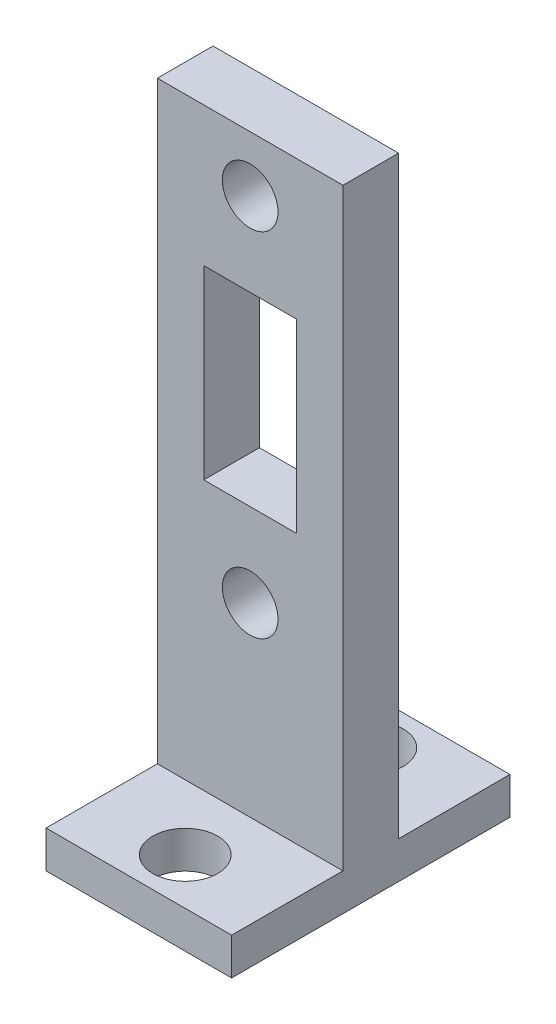
ISO-10303-21;
HEADER;
FILE_DESCRIPTION(('STEP AP214'),'2;1');
FILE_NAME('part.step','',(''),(''),'','','');
FILE_SCHEMA(('AUTOMOTIVE_DESIGN { 1 0 10303 214 1 1 1 1 }'));
ENDSEC;
DATA;
#1=APPLICATION_CONTEXT('core data for automotive mechanical design processes');
#2=APPLICATION_PROTOCOL_DEFINITION('international standard','automotive_design',2000,#1);
#3=PRODUCT_CONTEXT('',#1,'mechanical');
#4=PRODUCT('Part','Part','',(#3));
#5=PRODUCT_RELATED_PRODUCT_CATEGORY('part','',(#4));
#6=PRODUCT_DEFINITION_FORMATION('','',#4);
#7=PRODUCT_DEFINITION_CONTEXT('part definition',#1,'design');
#8=PRODUCT_DEFINITION('design','',#6,#7);
#9=PRODUCT_DEFINITION_SHAPE('','',#8);
#10=(LENGTH_UNIT() NAMED_UNIT(*) SI_UNIT(.MILLI.,.METRE.));
#11=(NAMED_UNIT(*) PLANE_ANGLE_UNIT() SI_UNIT($,.RADIAN.));
#12=(NAMED_UNIT(*) SI_UNIT($,.STERADIAN.) SOLID_ANGLE_UNIT());
#13=UNCERTAINTY_MEASURE_WITH_UNIT(LENGTH_MEASURE(1.E-05),#10,'distance_accuracy_value','');
#14=(GEOMETRIC_REPRESENTATION_CONTEXT(3) GLOBAL_UNCERTAINTY_ASSIGNED_CONTEXT((#13)) GLOBAL_UNIT_ASSIGNED_CONTEXT((#10,
#11,#12)) REPRESENTATION_CONTEXT('',''));
#15=CARTESIAN_POINT('',(0.,0.,0.));
#16=DIRECTION('',(0.,0.,1.));
#17=DIRECTION('',(1.,0.,0.));
#18=AXIS2_PLACEMENT_3D('',#15,#16,#17);
#19=CARTESIAN_POINT('',(0.,2.,0.));
#20=DIRECTION('',(0.,1.,0.));
#21=DIRECTION('',(0.,0.,1.));
#22=AXIS2_PLACEMENT_3D('',#19,#20,#21);
#23=PLANE('',#22);
#24=DIRECTION('',(1.,0.,0.));
#25=VECTOR('',#24,1.);
#26=CARTESIAN_POINT('',(-5.,2.,1.5));
#27=LINE('',#26,#25);
#28=CARTESIAN_POINT('',(-5.,2.,1.5));
#29=VERTEX_POINT('',#28);
#30=CARTESIAN_POINT('',(5.,2.,1.5));
#31=VERTEX_POINT('',#30);
#32=EDGE_CURVE('E199',#29,#31,#27,.T.);
#33=ORIENTED_EDGE('',*,*,#32,.F.);
#34=DIRECTION('',(0.,0.,1.));
#35=VECTOR('',#34,1.);
#36=CARTESIAN_POINT('',(-5.,2.,7.5));
#37=LINE('',#36,#35);
#38=CARTESIAN_POINT('',(-5.,2.,7.5));
#39=VERTEX_POINT('',#38);
#40=EDGE_CURVE('E251',#29,#39,#37,.T.);
#41=ORIENTED_EDGE('',*,*,#40,.T.);
#42=DIRECTION('',(1.,0.,0.));
#43=VECTOR('',#42,1.);
#44=CARTESIAN_POINT('',(5.,2.,7.5));
#45=LINE('',#44,#43);
#46=CARTESIAN_POINT('',(5.,2.,7.5));
#47=VERTEX_POINT('',#46);
#48=EDGE_CURVE('E250',#39,#47,#45,.T.);
#49=ORIENTED_EDGE('',*,*,#48,.T.);
#50=DIRECTION('',(0.,0.,-1.));
#51=VECTOR('',#50,1.);
#52=CARTESIAN_POINT('',(5.,2.,7.5));
#53=LINE('',#52,#51);
#54=EDGE_CURVE('E255',#47,#31,#53,.T.);
#55=ORIENTED_EDGE('',*,*,#54,.T.);
#56=EDGE_LOOP('',(#33,#41,#49,#55));
#57=FACE_BOUND('',#56,.T.);
#58=CARTESIAN_POINT('',(0.,2.,5.));
#59=DIRECTION('',(0.,1.,0.));
#60=DIRECTION('',(0.,0.,1.));
#61=AXIS2_PLACEMENT_3D('',#58,#59,#60);
#62=CIRCLE('',#61,1.75);
#63=CARTESIAN_POINT('',(0.,2.,6.75));
#64=VERTEX_POINT('',#63);
#65=EDGE_CURVE('E231',#64,#64,#62,.T.);
#66=ORIENTED_EDGE('',*,*,#65,.F.);
#67=EDGE_LOOP('',(#66));
#68=FACE_BOUND('',#67,.T.);
#69=ADVANCED_FACE('F39',(#57,#68),#23,.T.);
#70=DIRECTION('',(-1.,0.,0.));
#71=VECTOR('',#70,1.);
#72=CARTESIAN_POINT('',(-5.,2.,-1.5));
#73=LINE('',#72,#71);
#74=CARTESIAN_POINT('',(5.,2.,-1.5));
#75=VERTEX_POINT('',#74);
#76=CARTESIAN_POINT('',(-5.,2.,-1.5));
#77=VERTEX_POINT('',#76);
#78=EDGE_CURVE('E193',#75,#77,#73,.T.);
#79=ORIENTED_EDGE('',*,*,#78,.F.);
#80=CARTESIAN_POINT('',(5.,2.,-7.5));
#81=VERTEX_POINT('',#80);
#82=EDGE_CURVE('E254',#75,#81,#53,.T.);
#83=ORIENTED_EDGE('',*,*,#82,.T.);
#84=DIRECTION('',(-1.,0.,0.));
#85=VECTOR('',#84,1.);
#86=CARTESIAN_POINT('',(5.,2.,-7.5));
#87=LINE('',#86,#85);
#88=CARTESIAN_POINT('',(-5.,2.,-7.5));
#89=VERTEX_POINT('',#88);
#90=EDGE_CURVE('E258',#81,#89,#87,.T.);
#91=ORIENTED_EDGE('',*,*,#90,.T.);
#92=EDGE_CURVE('E247',#89,#77,#37,.T.);
#93=ORIENTED_EDGE('',*,*,#92,.T.);
#94=EDGE_LOOP('',(#79,#83,#91,#93));
#95=FACE_BOUND('',#94,.T.);
#96=CARTESIAN_POINT('',(0.,2.,-5.));
#97=DIRECTION('',(0.,1.,0.));
#98=DIRECTION('',(0.,0.,1.));
#99=AXIS2_PLACEMENT_3D('',#96,#97,#98);
#100=CIRCLE('',#99,1.75);
#101=CARTESIAN_POINT('',(0.,2.,-3.25));
#102=VERTEX_POINT('',#101);
#103=EDGE_CURVE('E239',#102,#102,#100,.T.);
#104=ORIENTED_EDGE('',*,*,#103,.F.);
#105=EDGE_LOOP('',(#104));
#106=FACE_BOUND('',#105,.T.);
#107=ADVANCED_FACE('F305',(#95,#106),#23,.T.);
#108=CARTESIAN_POINT('',(0.,0.,0.));
#109=DIRECTION('',(0.,1.,0.));
#110=DIRECTION('',(0.,0.,1.));
#111=AXIS2_PLACEMENT_3D('',#108,#109,#110);
#112=PLANE('',#111);
#113=DIRECTION('',(0.,0.,1.));
#114=VECTOR('',#113,1.);
#115=CARTESIAN_POINT('',(-5.,0.,7.5));
#116=LINE('',#115,#114);
#117=CARTESIAN_POINT('',(-5.,0.,-7.5));
#118=VERTEX_POINT('',#117);
#119=CARTESIAN_POINT('',(-5.,0.,7.5));
#120=VERTEX_POINT('',#119);
#121=EDGE_CURVE('E243',#118,#120,#116,.T.);
#122=ORIENTED_EDGE('',*,*,#121,.F.);
#123=DIRECTION('',(-1.,0.,0.));
#124=VECTOR('',#123,1.);
#125=CARTESIAN_POINT('',(5.,0.,-7.5));
#126=LINE('',#125,#124);
#127=CARTESIAN_POINT('',(5.,0.,-7.5));
#128=VERTEX_POINT('',#127);
#129=EDGE_CURVE('E271',#128,#118,#126,.T.);
#130=ORIENTED_EDGE('',*,*,#129,.F.);
#131=DIRECTION('',(0.,0.,-1.));
#132=VECTOR('',#131,1.);
#133=CARTESIAN_POINT('',(5.,0.,7.5));
#134=LINE('',#133,#132);
#135=CARTESIAN_POINT('',(5.,0.,7.5));
#136=VERTEX_POINT('',#135);
#137=EDGE_CURVE('E268',#136,#128,#134,.T.);
#138=ORIENTED_EDGE('',*,*,#137,.F.);
#139=DIRECTION('',(1.,0.,0.));
#140=VECTOR('',#139,1.);
#141=CARTESIAN_POINT('',(5.,0.,7.5));
#142=LINE('',#141,#140);
#143=EDGE_CURVE('E265',#120,#136,#142,.T.);
#144=ORIENTED_EDGE('',*,*,#143,.F.);
#145=EDGE_LOOP('',(#122,#130,#138,#144));
#146=FACE_BOUND('',#145,.T.);
#147=CARTESIAN_POINT('',(0.,0.,-5.));
#148=DIRECTION('',(0.,1.,0.));
#149=DIRECTION('',(0.,0.,1.));
#150=AXIS2_PLACEMENT_3D('',#147,#148,#149);
#151=CIRCLE('',#150,1.75);
#152=CARTESIAN_POINT('',(0.,0.,-3.25));
#153=VERTEX_POINT('',#152);
#154=EDGE_CURVE('E235',#153,#153,#151,.T.);
#155=ORIENTED_EDGE('',*,*,#154,.T.);
#156=EDGE_LOOP('',(#155));
#157=FACE_BOUND('',#156,.T.);
#158=CARTESIAN_POINT('',(0.,0.,5.));
#159=DIRECTION('',(0.,1.,0.));
#160=DIRECTION('',(0.,0.,1.));
#161=AXIS2_PLACEMENT_3D('',#158,#159,#160);
#162=CIRCLE('',#161,1.75);
#163=CARTESIAN_POINT('',(0.,0.,6.75));
#164=VERTEX_POINT('',#163);
#165=EDGE_CURVE('E230',#164,#164,#162,.T.);
#166=ORIENTED_EDGE('',*,*,#165,.T.);
#167=EDGE_LOOP('',(#166));
#168=FACE_BOUND('',#167,.T.);
#169=ADVANCED_FACE('F293',(#146,#157,#168),#112,.F.);
#170=CARTESIAN_POINT('',(-5.,2.,7.5));
#171=DIRECTION('',(1.,0.,0.));
#172=DIRECTION('',(0.,0.,-1.));
#173=AXIS2_PLACEMENT_3D('',#170,#171,#172);
#174=PLANE('',#173);
#175=ORIENTED_EDGE('',*,*,#121,.T.);
#176=DIRECTION('',(0.,-1.,0.));
#177=VECTOR('',#176,1.);
#178=CARTESIAN_POINT('',(-5.,2.,7.5));
#179=LINE('',#178,#177);
#180=EDGE_CURVE('E11',#39,#120,#179,.T.);
#181=ORIENTED_EDGE('',*,*,#180,.F.);
#182=ORIENTED_EDGE('',*,*,#40,.F.);
#183=DIRECTION('',(0.,-1.,0.));
#184=VECTOR('',#183,1.);
#185=CARTESIAN_POINT('',(-5.,34.,1.5));
#186=LINE('',#185,#184);
#187=CARTESIAN_POINT('',(-5.,34.,1.5));
#188=VERTEX_POINT('',#187);
#189=EDGE_CURVE('E218',#188,#29,#186,.T.);
#190=ORIENTED_EDGE('',*,*,#189,.F.);
#191=DIRECTION('',(0.,0.,1.));
#192=VECTOR('',#191,1.);
#193=CARTESIAN_POINT('',(-5.,34.,-1.5));
#194=LINE('',#193,#192);
#195=CARTESIAN_POINT('',(-5.,34.,-1.5));
#196=VERTEX_POINT('',#195);
#197=EDGE_CURVE('E202',#196,#188,#194,.T.);
#198=ORIENTED_EDGE('',*,*,#197,.F.);
#199=DIRECTION('',(0.,-1.,0.));
#200=VECTOR('',#199,1.);
#201=CARTESIAN_POINT('',(-5.,34.,-1.5));
#202=LINE('',#201,#200);
#203=EDGE_CURVE('E222',#196,#77,#202,.T.);
#204=ORIENTED_EDGE('',*,*,#203,.T.);
#205=ORIENTED_EDGE('',*,*,#92,.F.);
#206=DIRECTION('',(0.,-1.,0.));
#207=VECTOR('',#206,1.);
#208=CARTESIAN_POINT('',(-5.,2.,-7.5));
#209=LINE('',#208,#207);
#210=EDGE_CURVE('E261',#89,#118,#209,.T.);
#211=ORIENTED_EDGE('',*,*,#210,.T.);
#212=EDGE_LOOP('',(#175,#181,#182,#190,#198,#204,#205,#211));
#213=FACE_BOUND('',#212,.T.);
#214=ADVANCED_FACE('F41',(#213),#174,.F.);
#215=CARTESIAN_POINT('',(5.,2.,7.5));
#216=DIRECTION('',(0.,0.,-1.));
#217=DIRECTION('',(-1.,0.,0.));
#218=AXIS2_PLACEMENT_3D('',#215,#216,#217);
#219=PLANE('',#218);
#220=ORIENTED_EDGE('',*,*,#143,.T.);
#221=DIRECTION('',(0.,-1.,0.));
#222=VECTOR('',#221,1.);
#223=CARTESIAN_POINT('',(5.,2.,7.5));
#224=LINE('',#223,#222);
#225=EDGE_CURVE('E48',#47,#136,#224,.T.);
#226=ORIENTED_EDGE('',*,*,#225,.F.);
#227=ORIENTED_EDGE('',*,*,#48,.F.);
#228=ORIENTED_EDGE('',*,*,#180,.T.);
#229=EDGE_LOOP('',(#220,#226,#227,#228));
#230=FACE_BOUND('',#229,.T.);
#231=ADVANCED_FACE('F318',(#230),#219,.F.);
#232=CARTESIAN_POINT('',(5.,2.,7.5));
#233=DIRECTION('',(-1.,0.,0.));
#234=DIRECTION('',(0.,0.,1.));
#235=AXIS2_PLACEMENT_3D('',#232,#233,#234);
#236=PLANE('',#235);
#237=ORIENTED_EDGE('',*,*,#137,.T.);
#238=DIRECTION('',(0.,-1.,0.));
#239=VECTOR('',#238,1.);
#240=CARTESIAN_POINT('',(5.,2.,-7.5));
#241=LINE('',#240,#239);
#242=EDGE_CURVE('E277',#81,#128,#241,.T.);
#243=ORIENTED_EDGE('',*,*,#242,.F.);
#244=ORIENTED_EDGE('',*,*,#82,.F.);
#245=DIRECTION('',(0.,-1.,0.));
#246=VECTOR('',#245,1.);
#247=CARTESIAN_POINT('',(5.,34.,-1.5));
#248=LINE('',#247,#246);
#249=CARTESIAN_POINT('',(5.,34.,-1.5));
#250=VERTEX_POINT('',#249);
#251=EDGE_CURVE('E226',#250,#75,#248,.T.);
#252=ORIENTED_EDGE('',*,*,#251,.F.);
#253=DIRECTION('',(0.,0.,-1.));
#254=VECTOR('',#253,1.);
#255=CARTESIAN_POINT('',(5.,34.,-1.5));
#256=LINE('',#255,#254);
#257=CARTESIAN_POINT('',(5.,34.,1.5));
#258=VERTEX_POINT('',#257);
#259=EDGE_CURVE('E194',#258,#250,#256,.T.);
#260=ORIENTED_EDGE('',*,*,#259,.F.);
#261=DIRECTION('',(0.,-1.,0.));
#262=VECTOR('',#261,1.);
#263=CARTESIAN_POINT('',(5.,34.,1.5));
#264=LINE('',#263,#262);
#265=EDGE_CURVE('E208',#258,#31,#264,.T.);
#266=ORIENTED_EDGE('',*,*,#265,.T.);
#267=ORIENTED_EDGE('',*,*,#54,.F.);
#268=ORIENTED_EDGE('',*,*,#225,.T.);
#269=EDGE_LOOP('',(#237,#243,#244,#252,#260,#266,#267,#268));
#270=FACE_BOUND('',#269,.T.);
#271=ADVANCED_FACE('F286',(#270),#236,.F.);
#272=CARTESIAN_POINT('',(5.,2.,-7.5));
#273=DIRECTION('',(0.,0.,1.));
#274=DIRECTION('',(1.,0.,0.));
#275=AXIS2_PLACEMENT_3D('',#272,#273,#274);
#276=PLANE('',#275);
#277=ORIENTED_EDGE('',*,*,#129,.T.);
#278=ORIENTED_EDGE('',*,*,#210,.F.);
#279=ORIENTED_EDGE('',*,*,#90,.F.);
#280=ORIENTED_EDGE('',*,*,#242,.T.);
#281=EDGE_LOOP('',(#277,#278,#279,#280));
#282=FACE_BOUND('',#281,.T.);
#283=ADVANCED_FACE('F297',(#282),#276,.F.);
#284=CARTESIAN_POINT('',(0.,2.,-5.));
#285=DIRECTION('',(0.,-1.,0.));
#286=DIRECTION('',(0.,0.,-1.));
#287=AXIS2_PLACEMENT_3D('',#284,#285,#286);
#288=CYLINDRICAL_SURFACE('',#287,1.75);
#289=ORIENTED_EDGE('',*,*,#103,.T.);
#290=EDGE_LOOP('',(#289));
#291=FACE_BOUND('',#290,.T.);
#292=ORIENTED_EDGE('',*,*,#154,.F.);
#293=EDGE_LOOP('',(#292));
#294=FACE_BOUND('',#293,.T.);
#295=ADVANCED_FACE('F332',(#291,#294),#288,.F.);
#296=CARTESIAN_POINT('',(0.,2.,5.));
#297=DIRECTION('',(0.,-1.,0.));
#298=DIRECTION('',(0.,0.,-1.));
#299=AXIS2_PLACEMENT_3D('',#296,#297,#298);
#300=CYLINDRICAL_SURFACE('',#299,1.75);
#301=ORIENTED_EDGE('',*,*,#65,.T.);
#302=EDGE_LOOP('',(#301));
#303=FACE_BOUND('',#302,.T.);
#304=ORIENTED_EDGE('',*,*,#165,.F.);
#305=EDGE_LOOP('',(#304));
#306=FACE_BOUND('',#305,.T.);
#307=ADVANCED_FACE('F340',(#303,#306),#300,.F.);
#308=CARTESIAN_POINT('',(-5.,34.,-1.5));
#309=DIRECTION('',(0.,0.,1.));
#310=DIRECTION('',(1.,0.,0.));
#311=AXIS2_PLACEMENT_3D('',#308,#309,#310);
#312=PLANE('',#311);
#313=DIRECTION('',(1.,0.,0.));
#314=VECTOR('',#313,1.);
#315=CARTESIAN_POINT('',(-5.,16.5,-1.5));
#316=LINE('',#315,#314);
#317=CARTESIAN_POINT('',(-2.5,16.5,-1.5));
#318=VERTEX_POINT('',#317);
#319=CARTESIAN_POINT('',(2.5,16.5,-1.5));
#320=VERTEX_POINT('',#319);
#321=EDGE_CURVE('E169',#318,#320,#316,.T.);
#322=ORIENTED_EDGE('',*,*,#321,.T.);
#323=DIRECTION('',(0.,1.,0.));
#324=VECTOR('',#323,1.);
#325=CARTESIAN_POINT('',(2.5,34.,-1.5));
#326=LINE('',#325,#324);
#327=CARTESIAN_POINT('',(2.5,26.5,-1.5));
#328=VERTEX_POINT('',#327);
#329=EDGE_CURVE('E173',#320,#328,#326,.T.);
#330=ORIENTED_EDGE('',*,*,#329,.T.);
#331=DIRECTION('',(-1.,0.,0.));
#332=VECTOR('',#331,1.);
#333=CARTESIAN_POINT('',(-5.,26.5,-1.5));
#334=LINE('',#333,#332);
#335=CARTESIAN_POINT('',(-2.5,26.5,-1.5));
#336=VERTEX_POINT('',#335);
#337=EDGE_CURVE('E160',#328,#336,#334,.T.);
#338=ORIENTED_EDGE('',*,*,#337,.T.);
#339=DIRECTION('',(0.,-1.,0.));
#340=VECTOR('',#339,1.);
#341=CARTESIAN_POINT('',(-2.5,34.,-1.5));
#342=LINE('',#341,#340);
#343=EDGE_CURVE('E135',#336,#318,#342,.T.);
#344=ORIENTED_EDGE('',*,*,#343,.T.);
#345=EDGE_LOOP('',(#322,#330,#338,#344));
#346=FACE_BOUND('',#345,.T.);
#347=CARTESIAN_POINT('',(0.,31.,-1.5));
#348=DIRECTION('',(0.,0.,1.));
#349=DIRECTION('',(1.,0.,0.));
#350=AXIS2_PLACEMENT_3D('',#347,#348,#349);
#351=CIRCLE('',#350,1.5);
#352=CARTESIAN_POINT('',(1.5,31.,-1.5));
#353=VERTEX_POINT('',#352);
#354=EDGE_CURVE('E189',#353,#353,#351,.T.);
#355=ORIENTED_EDGE('',*,*,#354,.T.);
#356=EDGE_LOOP('',(#355));
#357=FACE_BOUND('',#356,.T.);
#358=CARTESIAN_POINT('',(0.,12.,-1.5));
#359=DIRECTION('',(0.,0.,1.));
#360=DIRECTION('',(1.,0.,0.));
#361=AXIS2_PLACEMENT_3D('',#358,#359,#360);
#362=CIRCLE('',#361,1.5);
#363=CARTESIAN_POINT('',(1.5,12.,-1.5));
#364=VERTEX_POINT('',#363);
#365=EDGE_CURVE('E182',#364,#364,#362,.T.);
#366=ORIENTED_EDGE('',*,*,#365,.T.);
#367=EDGE_LOOP('',(#366));
#368=FACE_BOUND('',#367,.T.);
#369=ORIENTED_EDGE('',*,*,#78,.T.);
#370=ORIENTED_EDGE('',*,*,#203,.F.);
#371=DIRECTION('',(-1.,0.,0.));
#372=VECTOR('',#371,1.);
#373=CARTESIAN_POINT('',(-5.,34.,-1.5));
#374=LINE('',#373,#372);
#375=EDGE_CURVE('E198',#250,#196,#374,.T.);
#376=ORIENTED_EDGE('',*,*,#375,.F.);
#377=ORIENTED_EDGE('',*,*,#251,.T.);
#378=EDGE_LOOP('',(#369,#370,#376,#377));
#379=FACE_BOUND('',#378,.T.);
#380=ADVANCED_FACE('F309',(#346,#357,#368,#379),#312,.F.);
#381=CARTESIAN_POINT('',(-5.,34.,1.5));
#382=DIRECTION('',(0.,0.,-1.));
#383=DIRECTION('',(-1.,0.,0.));
#384=AXIS2_PLACEMENT_3D('',#381,#382,#383);
#385=PLANE('',#384);
#386=DIRECTION('',(-1.,0.,0.));
#387=VECTOR('',#386,1.);
#388=CARTESIAN_POINT('',(-2.5,26.5,1.5));
#389=LINE('',#388,#387);
#390=CARTESIAN_POINT('',(2.5,26.5,1.5));
#391=VERTEX_POINT('',#390);
#392=CARTESIAN_POINT('',(-2.5,26.5,1.5));
#393=VERTEX_POINT('',#392);
#394=EDGE_CURVE('E142',#391,#393,#389,.T.);
#395=ORIENTED_EDGE('',*,*,#394,.F.);
#396=DIRECTION('',(0.,1.,0.));
#397=VECTOR('',#396,1.);
#398=CARTESIAN_POINT('',(2.5,26.5,1.5));
#399=LINE('',#398,#397);
#400=CARTESIAN_POINT('',(2.5,16.5,1.5));
#401=VERTEX_POINT('',#400);
#402=EDGE_CURVE('E63',#401,#391,#399,.T.);
#403=ORIENTED_EDGE('',*,*,#402,.F.);
#404=DIRECTION('',(1.,0.,0.));
#405=VECTOR('',#404,1.);
#406=CARTESIAN_POINT('',(-2.5,16.5,1.5));
#407=LINE('',#406,#405);
#408=CARTESIAN_POINT('',(-2.5,16.5,1.5));
#409=VERTEX_POINT('',#408);
#410=EDGE_CURVE('E150',#409,#401,#407,.T.);
#411=ORIENTED_EDGE('',*,*,#410,.F.);
#412=DIRECTION('',(0.,-1.,0.));
#413=VECTOR('',#412,1.);
#414=CARTESIAN_POINT('',(-2.5,26.5,1.5));
#415=LINE('',#414,#413);
#416=EDGE_CURVE('E132',#393,#409,#415,.T.);
#417=ORIENTED_EDGE('',*,*,#416,.F.);
#418=EDGE_LOOP('',(#395,#403,#411,#417));
#419=FACE_BOUND('',#418,.T.);
#420=CARTESIAN_POINT('',(0.,31.,1.5));
#421=DIRECTION('',(0.,0.,1.));
#422=DIRECTION('',(1.,0.,0.));
#423=AXIS2_PLACEMENT_3D('',#420,#421,#422);
#424=CIRCLE('',#423,1.5);
#425=CARTESIAN_POINT('',(1.5,31.,1.5));
#426=VERTEX_POINT('',#425);
#427=EDGE_CURVE('E178',#426,#426,#424,.T.);
#428=ORIENTED_EDGE('',*,*,#427,.F.);
#429=EDGE_LOOP('',(#428));
#430=FACE_BOUND('',#429,.T.);
#431=CARTESIAN_POINT('',(0.,12.,1.5));
#432=DIRECTION('',(0.,0.,1.));
#433=DIRECTION('',(1.,0.,0.));
#434=AXIS2_PLACEMENT_3D('',#431,#432,#433);
#435=CIRCLE('',#434,1.5);
#436=CARTESIAN_POINT('',(1.5,12.,1.5));
#437=VERTEX_POINT('',#436);
#438=EDGE_CURVE('E177',#437,#437,#435,.T.);
#439=ORIENTED_EDGE('',*,*,#438,.F.);
#440=EDGE_LOOP('',(#439));
#441=FACE_BOUND('',#440,.T.);
#442=ORIENTED_EDGE('',*,*,#32,.T.);
#443=ORIENTED_EDGE('',*,*,#265,.F.);
#444=DIRECTION('',(1.,0.,0.));
#445=VECTOR('',#444,1.);
#446=CARTESIAN_POINT('',(-5.,34.,1.5));
#447=LINE('',#446,#445);
#448=EDGE_CURVE('E205',#188,#258,#447,.T.);
#449=ORIENTED_EDGE('',*,*,#448,.F.);
#450=ORIENTED_EDGE('',*,*,#189,.T.);
#451=EDGE_LOOP('',(#442,#443,#449,#450));
#452=FACE_BOUND('',#451,.T.);
#453=ADVANCED_FACE('F147',(#419,#430,#441,#452),#385,.F.);
#454=CARTESIAN_POINT('',(0.,34.,0.));
#455=DIRECTION('',(0.,1.,0.));
#456=DIRECTION('',(0.,0.,1.));
#457=AXIS2_PLACEMENT_3D('',#454,#455,#456);
#458=PLANE('',#457);
#459=ORIENTED_EDGE('',*,*,#259,.T.);
#460=ORIENTED_EDGE('',*,*,#375,.T.);
#461=ORIENTED_EDGE('',*,*,#197,.T.);
#462=ORIENTED_EDGE('',*,*,#448,.T.);
#463=EDGE_LOOP('',(#459,#460,#461,#462));
#464=FACE_BOUND('',#463,.T.);
#465=ADVANCED_FACE('F360',(#464),#458,.T.);
#466=CARTESIAN_POINT('',(0.,12.,-7.5));
#467=DIRECTION('',(0.,0.,1.));
#468=DIRECTION('',(1.,0.,0.));
#469=AXIS2_PLACEMENT_3D('',#466,#467,#468);
#470=CYLINDRICAL_SURFACE('',#469,1.5);
#471=ORIENTED_EDGE('',*,*,#438,.T.);
#472=EDGE_LOOP('',(#471));
#473=FACE_BOUND('',#472,.T.);
#474=ORIENTED_EDGE('',*,*,#365,.F.);
#475=EDGE_LOOP('',(#474));
#476=FACE_BOUND('',#475,.T.);
#477=ADVANCED_FACE('F363',(#473,#476),#470,.F.);
#478=CARTESIAN_POINT('',(0.,31.,-7.5));
#479=DIRECTION('',(0.,0.,1.));
#480=DIRECTION('',(1.,0.,0.));
#481=AXIS2_PLACEMENT_3D('',#478,#479,#480);
#482=CYLINDRICAL_SURFACE('',#481,1.5);
#483=ORIENTED_EDGE('',*,*,#427,.T.);
#484=EDGE_LOOP('',(#483));
#485=FACE_BOUND('',#484,.T.);
#486=ORIENTED_EDGE('',*,*,#354,.F.);
#487=EDGE_LOOP('',(#486));
#488=FACE_BOUND('',#487,.T.);
#489=ADVANCED_FACE('F367',(#485,#488),#482,.F.);
#490=CARTESIAN_POINT('',(2.5,26.5,-7.5));
#491=DIRECTION('',(1.,0.,0.));
#492=DIRECTION('',(0.,1.,0.));
#493=AXIS2_PLACEMENT_3D('',#490,#491,#492);
#494=PLANE('',#493);
#495=DIRECTION('',(0.,0.,1.));
#496=VECTOR('',#495,1.);
#497=CARTESIAN_POINT('',(2.5,16.5,-7.5));
#498=LINE('',#497,#496);
#499=EDGE_CURVE('E157',#320,#401,#498,.T.);
#500=ORIENTED_EDGE('',*,*,#499,.T.);
#501=ORIENTED_EDGE('',*,*,#402,.T.);
#502=DIRECTION('',(0.,0.,1.));
#503=VECTOR('',#502,1.);
#504=CARTESIAN_POINT('',(2.5,26.5,-7.5));
#505=LINE('',#504,#503);
#506=EDGE_CURVE('E139',#328,#391,#505,.T.);
#507=ORIENTED_EDGE('',*,*,#506,.F.);
#508=ORIENTED_EDGE('',*,*,#329,.F.);
#509=EDGE_LOOP('',(#500,#501,#507,#508));
#510=FACE_BOUND('',#509,.T.);
#511=ADVANCED_FACE('F371',(#510),#494,.F.);
#512=CARTESIAN_POINT('',(-2.5,16.5,-7.5));
#513=DIRECTION('',(0.,-1.,0.));
#514=DIRECTION('',(0.,0.,-1.));
#515=AXIS2_PLACEMENT_3D('',#512,#513,#514);
#516=PLANE('',#515);
#517=DIRECTION('',(0.,0.,1.));
#518=VECTOR('',#517,1.);
#519=CARTESIAN_POINT('',(-2.5,16.5,-7.5));
#520=LINE('',#519,#518);
#521=EDGE_CURVE('E138',#318,#409,#520,.T.);
#522=ORIENTED_EDGE('',*,*,#521,.T.);
#523=ORIENTED_EDGE('',*,*,#410,.T.);
#524=ORIENTED_EDGE('',*,*,#499,.F.);
#525=ORIENTED_EDGE('',*,*,#321,.F.);
#526=EDGE_LOOP('',(#522,#523,#524,#525));
#527=FACE_BOUND('',#526,.T.);
#528=ADVANCED_FACE('F375',(#527),#516,.F.);
#529=CARTESIAN_POINT('',(-2.5,26.5,-7.5));
#530=DIRECTION('',(-1.,0.,0.));
#531=DIRECTION('',(0.,-1.,0.));
#532=AXIS2_PLACEMENT_3D('',#529,#530,#531);
#533=PLANE('',#532);
#534=DIRECTION('',(0.,0.,1.));
#535=VECTOR('',#534,1.);
#536=CARTESIAN_POINT('',(-2.5,26.5,-7.5));
#537=LINE('',#536,#535);
#538=EDGE_CURVE('E55',#336,#393,#537,.T.);
#539=ORIENTED_EDGE('',*,*,#538,.T.);
#540=ORIENTED_EDGE('',*,*,#416,.T.);
#541=ORIENTED_EDGE('',*,*,#521,.F.);
#542=ORIENTED_EDGE('',*,*,#343,.F.);
#543=EDGE_LOOP('',(#539,#540,#541,#542));
#544=FACE_BOUND('',#543,.T.);
#545=ADVANCED_FACE('F129',(#544),#533,.F.);
#546=CARTESIAN_POINT('',(-2.5,26.5,-7.5));
#547=DIRECTION('',(0.,1.,0.));
#548=DIRECTION('',(0.,0.,1.));
#549=AXIS2_PLACEMENT_3D('',#546,#547,#548);
#550=PLANE('',#549);
#551=ORIENTED_EDGE('',*,*,#506,.T.);
#552=ORIENTED_EDGE('',*,*,#394,.T.);
#553=ORIENTED_EDGE('',*,*,#538,.F.);
#554=ORIENTED_EDGE('',*,*,#337,.F.);
#555=EDGE_LOOP('',(#551,#552,#553,#554));
#556=FACE_BOUND('',#555,.T.);
#557=ADVANCED_FACE('F143',(#556),#550,.F.);
#558=CLOSED_SHELL('',(#69,#107,#169,#214,#231,#271,#283,#295,#307,#380,#453,#465,#477,#489,#511,
#528,#545,#557));
#559=MANIFOLD_SOLID_BREP('B2',#558);
#560=ADVANCED_BREP_SHAPE_REPRESENTATION('',(#18,#559),#14);
#561=SHAPE_DEFINITION_REPRESENTATION(#9,#560);
ENDSEC;
END-ISO-10303-21;
